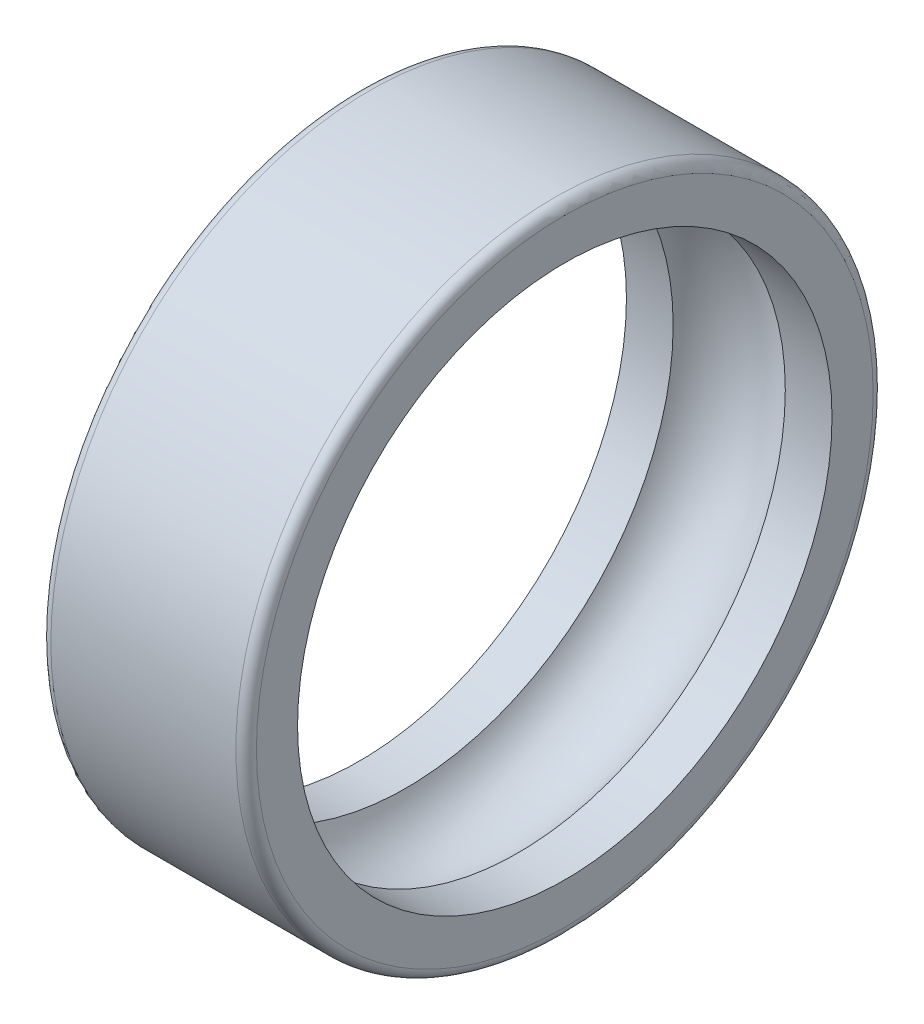
ISO-10303-21;
HEADER;
FILE_DESCRIPTION(('STEP AP214'),'2;1');
FILE_NAME('part.step','',(''),(''),'','','');
FILE_SCHEMA(('AUTOMOTIVE_DESIGN { 1 0 10303 214 1 1 1 1 }'));
ENDSEC;
DATA;
#1=APPLICATION_CONTEXT('core data for automotive mechanical design processes');
#2=APPLICATION_PROTOCOL_DEFINITION('international standard','automotive_design',2000,#1);
#3=PRODUCT_CONTEXT('',#1,'mechanical');
#4=PRODUCT('Part','Part','',(#3));
#5=PRODUCT_RELATED_PRODUCT_CATEGORY('part','',(#4));
#6=PRODUCT_DEFINITION_FORMATION('','',#4);
#7=PRODUCT_DEFINITION_CONTEXT('part definition',#1,'design');
#8=PRODUCT_DEFINITION('design','',#6,#7);
#9=PRODUCT_DEFINITION_SHAPE('','',#8);
#10=(LENGTH_UNIT() NAMED_UNIT(*) SI_UNIT(.MILLI.,.METRE.));
#11=(NAMED_UNIT(*) PLANE_ANGLE_UNIT() SI_UNIT($,.RADIAN.));
#12=(NAMED_UNIT(*) SI_UNIT($,.STERADIAN.) SOLID_ANGLE_UNIT());
#13=UNCERTAINTY_MEASURE_WITH_UNIT(LENGTH_MEASURE(1.E-05),#10,'distance_accuracy_value','');
#14=(GEOMETRIC_REPRESENTATION_CONTEXT(3) GLOBAL_UNCERTAINTY_ASSIGNED_CONTEXT((#13)) GLOBAL_UNIT_ASSIGNED_CONTEXT((#10,
#11,#12)) REPRESENTATION_CONTEXT('',''));
#15=CARTESIAN_POINT('',(0.,0.,0.));
#16=DIRECTION('',(0.,0.,1.));
#17=DIRECTION('',(1.,0.,0.));
#18=AXIS2_PLACEMENT_3D('',#15,#16,#17);
#19=CARTESIAN_POINT('',(30.3092783505155,0.,0.));
#20=DIRECTION('',(1.,0.,0.));
#21=DIRECTION('',(0.,0.,-1.));
#22=AXIS2_PLACEMENT_3D('',#19,#20,#21);
#23=CYLINDRICAL_SURFACE('',#22,26.);
#24=CARTESIAN_POINT('',(-5.45435605731786,0.,0.));
#25=DIRECTION('',(1.,0.,0.));
#26=DIRECTION('',(0.,0.,-1.));
#27=AXIS2_PLACEMENT_3D('',#24,#25,#26);
#28=CIRCLE('',#27,26.);
#29=CARTESIAN_POINT('',(-5.45435605731786,0.,-26.));
#30=VERTEX_POINT('',#29);
#31=EDGE_CURVE('E60',#30,#30,#28,.T.);
#32=ORIENTED_EDGE('',*,*,#31,.T.);
#33=EDGE_LOOP('',(#32));
#34=FACE_BOUND('',#33,.T.);
#35=CARTESIAN_POINT('',(-10.,0.,0.));
#36=DIRECTION('',(1.,0.,0.));
#37=DIRECTION('',(0.,0.,-1.));
#38=AXIS2_PLACEMENT_3D('',#35,#36,#37);
#39=CIRCLE('',#38,26.);
#40=CARTESIAN_POINT('',(-10.,0.,-26.));
#41=VERTEX_POINT('',#40);
#42=EDGE_CURVE('E51',#41,#41,#39,.T.);
#43=ORIENTED_EDGE('',*,*,#42,.F.);
#44=EDGE_LOOP('',(#43));
#45=FACE_BOUND('',#44,.T.);
#46=ADVANCED_FACE('F31',(#34,#45),#23,.F.);
#47=CARTESIAN_POINT('',(-10.,31.,0.));
#48=DIRECTION('',(-1.,0.,0.));
#49=DIRECTION('',(0.,0.,1.));
#50=AXIS2_PLACEMENT_3D('',#47,#48,#49);
#51=PLANE('',#50);
#52=CARTESIAN_POINT('',(-10.,0.,0.));
#53=DIRECTION('',(-1.,0.,0.));
#54=DIRECTION('',(0.,0.,1.));
#55=AXIS2_PLACEMENT_3D('',#52,#53,#54);
#56=CIRCLE('',#55,30.);
#57=CARTESIAN_POINT('',(-10.,0.,30.));
#58=VERTEX_POINT('',#57);
#59=EDGE_CURVE('E10',#58,#58,#56,.T.);
#60=ORIENTED_EDGE('',*,*,#59,.T.);
#61=EDGE_LOOP('',(#60));
#62=FACE_BOUND('',#61,.T.);
#63=ORIENTED_EDGE('',*,*,#42,.T.);
#64=EDGE_LOOP('',(#63));
#65=FACE_BOUND('',#64,.T.);
#66=ADVANCED_FACE('F81',(#62,#65),#51,.T.);
#67=CARTESIAN_POINT('',(30.3092783505155,0.,0.));
#68=DIRECTION('',(1.,0.,0.));
#69=DIRECTION('',(0.,0.,-1.));
#70=AXIS2_PLACEMENT_3D('',#67,#68,#69);
#71=CYLINDRICAL_SURFACE('',#70,31.);
#72=CARTESIAN_POINT('',(9.,0.,0.));
#73=DIRECTION('',(1.,0.,0.));
#74=DIRECTION('',(0.,0.,-1.));
#75=AXIS2_PLACEMENT_3D('',#72,#73,#74);
#76=CIRCLE('',#75,31.);
#77=CARTESIAN_POINT('',(9.,0.,-31.));
#78=VERTEX_POINT('',#77);
#79=EDGE_CURVE('E38',#78,#78,#76,.F.);
#80=ORIENTED_EDGE('',*,*,#79,.T.);
#81=EDGE_LOOP('',(#80));
#82=FACE_BOUND('',#81,.T.);
#83=CARTESIAN_POINT('',(-9.00000000000001,0.,0.));
#84=DIRECTION('',(-1.,0.,0.));
#85=DIRECTION('',(0.,0.,1.));
#86=AXIS2_PLACEMENT_3D('',#83,#84,#85);
#87=CIRCLE('',#86,31.);
#88=CARTESIAN_POINT('',(-9.00000000000001,0.,31.));
#89=VERTEX_POINT('',#88);
#90=EDGE_CURVE('E42',#89,#89,#87,.F.);
#91=ORIENTED_EDGE('',*,*,#90,.T.);
#92=EDGE_LOOP('',(#91));
#93=FACE_BOUND('',#92,.T.);
#94=ADVANCED_FACE('F87',(#82,#93),#71,.T.);
#95=CARTESIAN_POINT('',(10.,31.,0.));
#96=DIRECTION('',(1.,0.,0.));
#97=DIRECTION('',(0.,0.,-1.));
#98=AXIS2_PLACEMENT_3D('',#95,#96,#97);
#99=PLANE('',#98);
#100=CARTESIAN_POINT('',(10.,0.,0.));
#101=DIRECTION('',(1.,0.,0.));
#102=DIRECTION('',(0.,0.,-1.));
#103=AXIS2_PLACEMENT_3D('',#100,#101,#102);
#104=CIRCLE('',#103,30.);
#105=CARTESIAN_POINT('',(10.,0.,-30.));
#106=VERTEX_POINT('',#105);
#107=EDGE_CURVE('E46',#106,#106,#104,.T.);
#108=ORIENTED_EDGE('',*,*,#107,.T.);
#109=EDGE_LOOP('',(#108));
#110=FACE_BOUND('',#109,.T.);
#111=CARTESIAN_POINT('',(10.,0.,0.));
#112=DIRECTION('',(1.,0.,0.));
#113=DIRECTION('',(0.,0.,-1.));
#114=AXIS2_PLACEMENT_3D('',#111,#112,#113);
#115=CIRCLE('',#114,26.);
#116=CARTESIAN_POINT('',(10.,0.,-26.));
#117=VERTEX_POINT('',#116);
#118=EDGE_CURVE('E54',#117,#117,#115,.T.);
#119=ORIENTED_EDGE('',*,*,#118,.F.);
#120=EDGE_LOOP('',(#119));
#121=FACE_BOUND('',#120,.T.);
#122=ADVANCED_FACE('F77',(#110,#121),#99,.T.);
#123=CARTESIAN_POINT('',(30.3092783505155,0.,0.));
#124=DIRECTION('',(1.,0.,0.));
#125=DIRECTION('',(0.,0.,-1.));
#126=AXIS2_PLACEMENT_3D('',#123,#124,#125);
#127=CYLINDRICAL_SURFACE('',#126,26.);
#128=ORIENTED_EDGE('',*,*,#118,.T.);
#129=EDGE_LOOP('',(#128));
#130=FACE_BOUND('',#129,.T.);
#131=CARTESIAN_POINT('',(5.45435605731786,0.,0.));
#132=DIRECTION('',(1.,0.,0.));
#133=DIRECTION('',(0.,0.,-1.));
#134=AXIS2_PLACEMENT_3D('',#131,#132,#133);
#135=CIRCLE('',#134,26.);
#136=CARTESIAN_POINT('',(5.45435605731786,0.,-26.));
#137=VERTEX_POINT('',#136);
#138=EDGE_CURVE('E57',#137,#137,#135,.T.);
#139=ORIENTED_EDGE('',*,*,#138,.F.);
#140=EDGE_LOOP('',(#139));
#141=FACE_BOUND('',#140,.T.);
#142=ADVANCED_FACE('F69',(#130,#141),#127,.F.);
#143=CARTESIAN_POINT('',(0.,0.,0.));
#144=DIRECTION('',(1.,0.,0.));
#145=DIRECTION('',(0.,0.,-1.));
#146=AXIS2_PLACEMENT_3D('',#143,#144,#145);
#147=TOROIDAL_SURFACE('',#146,23.5,6.);
#148=ORIENTED_EDGE('',*,*,#138,.T.);
#149=EDGE_LOOP('',(#148));
#150=FACE_BOUND('',#149,.T.);
#151=ORIENTED_EDGE('',*,*,#31,.F.);
#152=EDGE_LOOP('',(#151));
#153=FACE_BOUND('',#152,.T.);
#154=ADVANCED_FACE('F66',(#150,#153),#147,.F.);
#155=CARTESIAN_POINT('',(9.,0.,0.));
#156=DIRECTION('',(1.,0.,0.));
#157=DIRECTION('',(0.,0.,-1.));
#158=AXIS2_PLACEMENT_3D('',#155,#156,#157);
#159=TOROIDAL_SURFACE('',#158,30.,1.);
#160=ORIENTED_EDGE('',*,*,#79,.F.);
#161=EDGE_LOOP('',(#160));
#162=FACE_BOUND('',#161,.T.);
#163=ORIENTED_EDGE('',*,*,#107,.F.);
#164=EDGE_LOOP('',(#163));
#165=FACE_BOUND('',#164,.T.);
#166=ADVANCED_FACE('F68',(#162,#165),#159,.T.);
#167=CARTESIAN_POINT('',(-9.00000000000001,0.,0.));
#168=DIRECTION('',(-1.,0.,0.));
#169=DIRECTION('',(0.,0.,1.));
#170=AXIS2_PLACEMENT_3D('',#167,#168,#169);
#171=TOROIDAL_SURFACE('',#170,30.,1.);
#172=ORIENTED_EDGE('',*,*,#59,.F.);
#173=EDGE_LOOP('',(#172));
#174=FACE_BOUND('',#173,.T.);
#175=ORIENTED_EDGE('',*,*,#90,.F.);
#176=EDGE_LOOP('',(#175));
#177=FACE_BOUND('',#176,.T.);
#178=ADVANCED_FACE('F33',(#174,#177),#171,.T.);
#179=CLOSED_SHELL('',(#46,#66,#94,#122,#142,#154,#166,#178));
#180=MANIFOLD_SOLID_BREP('B2',#179);
#181=ADVANCED_BREP_SHAPE_REPRESENTATION('',(#18,#180),#14);
#182=SHAPE_DEFINITION_REPRESENTATION(#9,#181);
ENDSEC;
END-ISO-10303-21;
